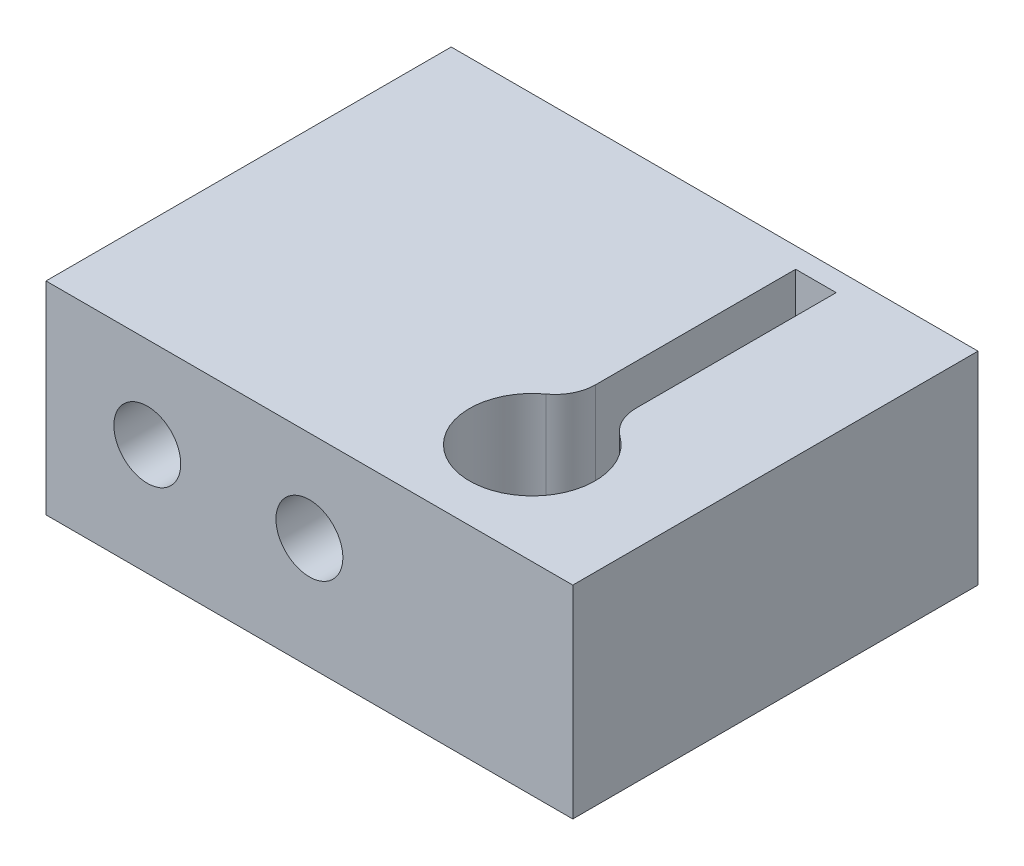
ISO-10303-21;
HEADER;
FILE_DESCRIPTION(('STEP AP214'),'2;1');
FILE_NAME('part.step','',(''),(''),'','','');
FILE_SCHEMA(('AUTOMOTIVE_DESIGN { 1 0 10303 214 1 1 1 1 }'));
ENDSEC;
DATA;
#1=APPLICATION_CONTEXT('core data for automotive mechanical design processes');
#2=APPLICATION_PROTOCOL_DEFINITION('international standard','automotive_design',2000,#1);
#3=PRODUCT_CONTEXT('',#1,'mechanical');
#4=PRODUCT('Part','Part','',(#3));
#5=PRODUCT_RELATED_PRODUCT_CATEGORY('part','',(#4));
#6=PRODUCT_DEFINITION_FORMATION('','',#4);
#7=PRODUCT_DEFINITION_CONTEXT('part definition',#1,'design');
#8=PRODUCT_DEFINITION('design','',#6,#7);
#9=PRODUCT_DEFINITION_SHAPE('','',#8);
#10=(LENGTH_UNIT() NAMED_UNIT(*) SI_UNIT(.MILLI.,.METRE.));
#11=(NAMED_UNIT(*) PLANE_ANGLE_UNIT() SI_UNIT($,.RADIAN.));
#12=(NAMED_UNIT(*) SI_UNIT($,.STERADIAN.) SOLID_ANGLE_UNIT());
#13=UNCERTAINTY_MEASURE_WITH_UNIT(LENGTH_MEASURE(1.E-05),#10,'distance_accuracy_value','');
#14=(GEOMETRIC_REPRESENTATION_CONTEXT(3) GLOBAL_UNCERTAINTY_ASSIGNED_CONTEXT((#13)) GLOBAL_UNIT_ASSIGNED_CONTEXT((#10,
#11,#12)) REPRESENTATION_CONTEXT('',''));
#15=CARTESIAN_POINT('',(0.,0.,0.));
#16=DIRECTION('',(0.,0.,1.));
#17=DIRECTION('',(1.,0.,0.));
#18=AXIS2_PLACEMENT_3D('',#15,#16,#17);
#19=CARTESIAN_POINT('',(13.,25.,10.));
#20=DIRECTION('',(-1.,0.,0.));
#21=DIRECTION('',(0.,0.,1.));
#22=AXIS2_PLACEMENT_3D('',#19,#20,#21);
#23=PLANE('',#22);
#24=DIRECTION('',(0.,-1.,0.));
#25=VECTOR('',#24,1.);
#26=CARTESIAN_POINT('',(13.,25.,-10.));
#27=LINE('',#26,#25);
#28=CARTESIAN_POINT('',(13.,15.,-10.));
#29=VERTEX_POINT('',#28);
#30=CARTESIAN_POINT('',(13.,5.,-10.));
#31=VERTEX_POINT('',#30);
#32=EDGE_CURVE('E224',#29,#31,#27,.T.);
#33=ORIENTED_EDGE('',*,*,#32,.F.);
#34=DIRECTION('',(0.,0.,-1.));
#35=VECTOR('',#34,1.);
#36=CARTESIAN_POINT('',(13.,15.,10.));
#37=LINE('',#36,#35);
#38=CARTESIAN_POINT('',(13.,15.,10.));
#39=VERTEX_POINT('',#38);
#40=EDGE_CURVE('E152',#39,#29,#37,.T.);
#41=ORIENTED_EDGE('',*,*,#40,.F.);
#42=DIRECTION('',(0.,-1.,0.));
#43=VECTOR('',#42,1.);
#44=CARTESIAN_POINT('',(13.,25.,10.));
#45=LINE('',#44,#43);
#46=CARTESIAN_POINT('',(13.,5.,10.));
#47=VERTEX_POINT('',#46);
#48=EDGE_CURVE('E203',#39,#47,#45,.T.);
#49=ORIENTED_EDGE('',*,*,#48,.T.);
#50=DIRECTION('',(0.,0.,1.));
#51=VECTOR('',#50,1.);
#52=CARTESIAN_POINT('',(13.,5.,10.));
#53=LINE('',#52,#51);
#54=EDGE_CURVE('E169',#31,#47,#53,.T.);
#55=ORIENTED_EDGE('',*,*,#54,.F.);
#56=EDGE_LOOP('',(#33,#41,#49,#55));
#57=FACE_BOUND('',#56,.T.);
#58=ADVANCED_FACE('F42',(#57),#23,.F.);
#59=CARTESIAN_POINT('',(-13.,25.,-10.));
#60=DIRECTION('',(0.,0.,1.));
#61=DIRECTION('',(1.,0.,0.));
#62=AXIS2_PLACEMENT_3D('',#59,#60,#61);
#63=PLANE('',#62);
#64=DIRECTION('',(1.,0.,0.));
#65=VECTOR('',#64,1.);
#66=CARTESIAN_POINT('',(-13.,5.,-10.));
#67=LINE('',#66,#65);
#68=CARTESIAN_POINT('',(-13.,5.,-10.));
#69=VERTEX_POINT('',#68);
#70=EDGE_CURVE('E174',#69,#31,#67,.T.);
#71=ORIENTED_EDGE('',*,*,#70,.F.);
#72=DIRECTION('',(0.,-1.,0.));
#73=VECTOR('',#72,1.);
#74=CARTESIAN_POINT('',(-13.,25.,-10.));
#75=LINE('',#74,#73);
#76=CARTESIAN_POINT('',(-13.,15.,-10.));
#77=VERTEX_POINT('',#76);
#78=EDGE_CURVE('E220',#77,#69,#75,.T.);
#79=ORIENTED_EDGE('',*,*,#78,.F.);
#80=DIRECTION('',(-1.,0.,0.));
#81=VECTOR('',#80,1.);
#82=CARTESIAN_POINT('',(13.,15.,-10.));
#83=LINE('',#82,#81);
#84=EDGE_CURVE('E146',#29,#77,#83,.T.);
#85=ORIENTED_EDGE('',*,*,#84,.F.);
#86=ORIENTED_EDGE('',*,*,#32,.T.);
#87=EDGE_LOOP('',(#71,#79,#85,#86));
#88=FACE_BOUND('',#87,.T.);
#89=CARTESIAN_POINT('',(0.,10.5,-10.));
#90=DIRECTION('',(0.,0.,-1.));
#91=DIRECTION('',(-1.,0.,0.));
#92=AXIS2_PLACEMENT_3D('',#89,#90,#91);
#93=CIRCLE('',#92,1.65);
#94=CARTESIAN_POINT('',(-1.65,10.5,-10.));
#95=VERTEX_POINT('',#94);
#96=EDGE_CURVE('E208',#95,#95,#93,.T.);
#97=ORIENTED_EDGE('',*,*,#96,.F.);
#98=EDGE_LOOP('',(#97));
#99=FACE_BOUND('',#98,.T.);
#100=CARTESIAN_POINT('',(-8.,10.5,-10.));
#101=DIRECTION('',(0.,0.,-1.));
#102=DIRECTION('',(-1.,0.,0.));
#103=AXIS2_PLACEMENT_3D('',#100,#101,#102);
#104=CIRCLE('',#103,1.65);
#105=CARTESIAN_POINT('',(-9.65,10.5,-10.));
#106=VERTEX_POINT('',#105);
#107=EDGE_CURVE('E204',#106,#106,#104,.T.);
#108=ORIENTED_EDGE('',*,*,#107,.F.);
#109=EDGE_LOOP('',(#108));
#110=FACE_BOUND('',#109,.T.);
#111=ADVANCED_FACE('F265',(#88,#99,#110),#63,.F.);
#112=CARTESIAN_POINT('',(-13.,25.,10.));
#113=DIRECTION('',(1.,0.,0.));
#114=DIRECTION('',(0.,0.,-1.));
#115=AXIS2_PLACEMENT_3D('',#112,#113,#114);
#116=PLANE('',#115);
#117=DIRECTION('',(0.,-1.,0.));
#118=VECTOR('',#117,1.);
#119=CARTESIAN_POINT('',(-13.,25.,10.));
#120=LINE('',#119,#118);
#121=CARTESIAN_POINT('',(-13.,15.,10.));
#122=VERTEX_POINT('',#121);
#123=CARTESIAN_POINT('',(-13.,5.,10.));
#124=VERTEX_POINT('',#123);
#125=EDGE_CURVE('E217',#122,#124,#120,.T.);
#126=ORIENTED_EDGE('',*,*,#125,.F.);
#127=DIRECTION('',(0.,0.,-1.));
#128=VECTOR('',#127,1.);
#129=CARTESIAN_POINT('',(-13.,15.,10.));
#130=LINE('',#129,#128);
#131=EDGE_CURVE('E129',#122,#77,#130,.T.);
#132=ORIENTED_EDGE('',*,*,#131,.T.);
#133=ORIENTED_EDGE('',*,*,#78,.T.);
#134=DIRECTION('',(0.,0.,1.));
#135=VECTOR('',#134,1.);
#136=CARTESIAN_POINT('',(-13.,5.,10.));
#137=LINE('',#136,#135);
#138=EDGE_CURVE('E170',#69,#124,#137,.T.);
#139=ORIENTED_EDGE('',*,*,#138,.T.);
#140=EDGE_LOOP('',(#126,#132,#133,#139));
#141=FACE_BOUND('',#140,.T.);
#142=ADVANCED_FACE('F273',(#141),#116,.F.);
#143=CARTESIAN_POINT('',(-13.,25.,10.));
#144=DIRECTION('',(0.,0.,-1.));
#145=DIRECTION('',(-1.,0.,0.));
#146=AXIS2_PLACEMENT_3D('',#143,#144,#145);
#147=PLANE('',#146);
#148=CARTESIAN_POINT('',(-8.,10.5,10.));
#149=DIRECTION('',(0.,0.,-1.));
#150=DIRECTION('',(-1.,0.,0.));
#151=AXIS2_PLACEMENT_3D('',#148,#149,#150);
#152=CIRCLE('',#151,1.65);
#153=CARTESIAN_POINT('',(-9.65,10.5,10.));
#154=VERTEX_POINT('',#153);
#155=EDGE_CURVE('E199',#154,#154,#152,.T.);
#156=ORIENTED_EDGE('',*,*,#155,.T.);
#157=EDGE_LOOP('',(#156));
#158=FACE_BOUND('',#157,.T.);
#159=CARTESIAN_POINT('',(0.,10.5,10.));
#160=DIRECTION('',(0.,0.,-1.));
#161=DIRECTION('',(-1.,0.,0.));
#162=AXIS2_PLACEMENT_3D('',#159,#160,#161);
#163=CIRCLE('',#162,1.65);
#164=CARTESIAN_POINT('',(-1.65,10.5,10.));
#165=VERTEX_POINT('',#164);
#166=EDGE_CURVE('E198',#165,#165,#163,.T.);
#167=ORIENTED_EDGE('',*,*,#166,.T.);
#168=EDGE_LOOP('',(#167));
#169=FACE_BOUND('',#168,.T.);
#170=ORIENTED_EDGE('',*,*,#48,.F.);
#171=DIRECTION('',(-1.,0.,0.));
#172=VECTOR('',#171,1.);
#173=CARTESIAN_POINT('',(13.,15.,10.));
#174=LINE('',#173,#172);
#175=EDGE_CURVE('E148',#39,#122,#174,.T.);
#176=ORIENTED_EDGE('',*,*,#175,.T.);
#177=ORIENTED_EDGE('',*,*,#125,.T.);
#178=DIRECTION('',(1.,0.,0.));
#179=VECTOR('',#178,1.);
#180=CARTESIAN_POINT('',(-13.,5.,10.));
#181=LINE('',#180,#179);
#182=EDGE_CURVE('E178',#124,#47,#181,.T.);
#183=ORIENTED_EDGE('',*,*,#182,.T.);
#184=EDGE_LOOP('',(#170,#176,#177,#183));
#185=FACE_BOUND('',#184,.T.);
#186=ADVANCED_FACE('F279',(#158,#169,#185),#147,.F.);
#187=CARTESIAN_POINT('',(6.,16.,5.));
#188=DIRECTION('',(0.,-1.,0.));
#189=DIRECTION('',(0.,0.,-1.));
#190=AXIS2_PLACEMENT_3D('',#187,#188,#189);
#191=CYLINDRICAL_SURFACE('',#190,3.1);
#192=DIRECTION('',(0.,-1.,0.));
#193=VECTOR('',#192,1.);
#194=CARTESIAN_POINT('',(4.17647058823529,16.,2.49306153158298));
#195=LINE('',#194,#193);
#196=CARTESIAN_POINT('',(4.17647058823529,5.,2.49306153158298));
#197=VERTEX_POINT('',#196);
#198=CARTESIAN_POINT('',(4.17647058823529,15.,2.49306153158298));
#199=VERTEX_POINT('',#198);
#200=EDGE_CURVE('E227',#197,#199,#195,.F.);
#201=ORIENTED_EDGE('',*,*,#200,.T.);
#202=CARTESIAN_POINT('',(6.,15.,5.));
#203=DIRECTION('',(0.,-1.,0.));
#204=DIRECTION('',(1.,0.,0.));
#205=AXIS2_PLACEMENT_3D('',#202,#203,#204);
#206=CIRCLE('',#205,3.1);
#207=CARTESIAN_POINT('',(7.8235294117647,15.,2.49306153158298));
#208=VERTEX_POINT('',#207);
#209=EDGE_CURVE('E128',#199,#208,#206,.F.);
#210=ORIENTED_EDGE('',*,*,#209,.T.);
#211=DIRECTION('',(0.,-1.,0.));
#212=VECTOR('',#211,1.);
#213=CARTESIAN_POINT('',(7.8235294117647,16.,2.49306153158298));
#214=LINE('',#213,#212);
#215=CARTESIAN_POINT('',(7.8235294117647,5.,2.49306153158298));
#216=VERTEX_POINT('',#215);
#217=EDGE_CURVE('E231',#208,#216,#214,.T.);
#218=ORIENTED_EDGE('',*,*,#217,.T.);
#219=CARTESIAN_POINT('',(6.,5.,5.));
#220=DIRECTION('',(0.,1.,0.));
#221=DIRECTION('',(0.,0.,1.));
#222=AXIS2_PLACEMENT_3D('',#219,#220,#221);
#223=CIRCLE('',#222,3.1);
#224=EDGE_CURVE('E187',#216,#197,#223,.F.);
#225=ORIENTED_EDGE('',*,*,#224,.T.);
#226=EDGE_LOOP('',(#201,#210,#218,#225));
#227=FACE_BOUND('',#226,.T.);
#228=ADVANCED_FACE('F250',(#227),#191,.F.);
#229=CARTESIAN_POINT('',(7.,16.,2.06571984977576));
#230=DIRECTION('',(1.,0.,0.));
#231=DIRECTION('',(0.,0.,-1.));
#232=AXIS2_PLACEMENT_3D('',#229,#230,#231);
#233=PLANE('',#232);
#234=DIRECTION('',(0.,0.,-1.));
#235=VECTOR('',#234,1.);
#236=CARTESIAN_POINT('',(7.,15.,2.06571984977576));
#237=LINE('',#236,#235);
#238=CARTESIAN_POINT('',(7.,15.,0.875681874539743));
#239=VERTEX_POINT('',#238);
#240=CARTESIAN_POINT('',(7.,15.,-9.00000000000001));
#241=VERTEX_POINT('',#240);
#242=EDGE_CURVE('E166',#239,#241,#237,.T.);
#243=ORIENTED_EDGE('',*,*,#242,.T.);
#244=DIRECTION('',(0.,1.,0.));
#245=VECTOR('',#244,1.);
#246=CARTESIAN_POINT('',(7.,5.,-9.));
#247=LINE('',#246,#245);
#248=CARTESIAN_POINT('',(7.,5.,-9.00000000000001));
#249=VERTEX_POINT('',#248);
#250=EDGE_CURVE('E58',#249,#241,#247,.T.);
#251=ORIENTED_EDGE('',*,*,#250,.F.);
#252=DIRECTION('',(0.,0.,1.));
#253=VECTOR('',#252,1.);
#254=CARTESIAN_POINT('',(7.,5.,2.06571984977576));
#255=LINE('',#254,#253);
#256=CARTESIAN_POINT('',(7.,5.,0.875681874539743));
#257=VERTEX_POINT('',#256);
#258=EDGE_CURVE('E195',#249,#257,#255,.T.);
#259=ORIENTED_EDGE('',*,*,#258,.T.);
#260=DIRECTION('',(0.,-1.,0.));
#261=VECTOR('',#260,1.);
#262=CARTESIAN_POINT('',(7.,16.,0.875681874539743));
#263=LINE('',#262,#261);
#264=EDGE_CURVE('E234',#257,#239,#263,.F.);
#265=ORIENTED_EDGE('',*,*,#264,.T.);
#266=EDGE_LOOP('',(#243,#251,#259,#265));
#267=FACE_BOUND('',#266,.T.);
#268=ADVANCED_FACE('F286',(#267),#233,.F.);
#269=CARTESIAN_POINT('',(5.,16.,2.06571984977576));
#270=DIRECTION('',(-1.,0.,0.));
#271=DIRECTION('',(0.,0.,1.));
#272=AXIS2_PLACEMENT_3D('',#269,#270,#271);
#273=PLANE('',#272);
#274=DIRECTION('',(0.,0.,-1.));
#275=VECTOR('',#274,1.);
#276=CARTESIAN_POINT('',(5.,5.,2.06571984977576));
#277=LINE('',#276,#275);
#278=CARTESIAN_POINT('',(5.,5.,0.875681874539745));
#279=VERTEX_POINT('',#278);
#280=CARTESIAN_POINT('',(5.,5.,-9.00000000000001));
#281=VERTEX_POINT('',#280);
#282=EDGE_CURVE('E66',#279,#281,#277,.T.);
#283=ORIENTED_EDGE('',*,*,#282,.T.);
#284=DIRECTION('',(0.,1.,0.));
#285=VECTOR('',#284,1.);
#286=CARTESIAN_POINT('',(5.,5.,-9.));
#287=LINE('',#286,#285);
#288=CARTESIAN_POINT('',(5.,15.,-9.));
#289=VERTEX_POINT('',#288);
#290=EDGE_CURVE('E131',#281,#289,#287,.T.);
#291=ORIENTED_EDGE('',*,*,#290,.T.);
#292=DIRECTION('',(0.,0.,1.));
#293=VECTOR('',#292,1.);
#294=CARTESIAN_POINT('',(5.,15.,2.06571984977576));
#295=LINE('',#294,#293);
#296=CARTESIAN_POINT('',(5.,15.,0.875681874539744));
#297=VERTEX_POINT('',#296);
#298=EDGE_CURVE('E120',#289,#297,#295,.T.);
#299=ORIENTED_EDGE('',*,*,#298,.T.);
#300=DIRECTION('',(0.,-1.,0.));
#301=VECTOR('',#300,1.);
#302=CARTESIAN_POINT('',(5.,16.,0.875681874539745));
#303=LINE('',#302,#301);
#304=EDGE_CURVE('E238',#297,#279,#303,.T.);
#305=ORIENTED_EDGE('',*,*,#304,.T.);
#306=EDGE_LOOP('',(#283,#291,#299,#305));
#307=FACE_BOUND('',#306,.T.);
#308=ADVANCED_FACE('F132',(#307),#273,.F.);
#309=CARTESIAN_POINT('',(9.,16.,0.875681874539743));
#310=DIRECTION('',(0.,-1.,0.));
#311=DIRECTION('',(0.,0.,-1.));
#312=AXIS2_PLACEMENT_3D('',#309,#310,#311);
#313=CYLINDRICAL_SURFACE('',#312,2.);
#314=CARTESIAN_POINT('',(9.,15.,0.875681874539743));
#315=DIRECTION('',(0.,-1.,0.));
#316=DIRECTION('',(1.,0.,0.));
#317=AXIS2_PLACEMENT_3D('',#314,#315,#316);
#318=CIRCLE('',#317,2.);
#319=EDGE_CURVE('E163',#239,#208,#318,.F.);
#320=ORIENTED_EDGE('',*,*,#319,.F.);
#321=ORIENTED_EDGE('',*,*,#264,.F.);
#322=CARTESIAN_POINT('',(9.,5.,0.875681874539743));
#323=DIRECTION('',(0.,1.,0.));
#324=DIRECTION('',(0.,0.,1.));
#325=AXIS2_PLACEMENT_3D('',#322,#323,#324);
#326=CIRCLE('',#325,2.);
#327=EDGE_CURVE('E191',#216,#257,#326,.F.);
#328=ORIENTED_EDGE('',*,*,#327,.F.);
#329=ORIENTED_EDGE('',*,*,#217,.F.);
#330=EDGE_LOOP('',(#320,#321,#328,#329));
#331=FACE_BOUND('',#330,.T.);
#332=ADVANCED_FACE('F254',(#331),#313,.T.);
#333=CARTESIAN_POINT('',(3.,16.,0.875681874539744));
#334=DIRECTION('',(0.,-1.,0.));
#335=DIRECTION('',(0.,0.,-1.));
#336=AXIS2_PLACEMENT_3D('',#333,#334,#335);
#337=CYLINDRICAL_SURFACE('',#336,2.);
#338=CARTESIAN_POINT('',(3.,15.,0.875681874539744));
#339=DIRECTION('',(0.,-1.,0.));
#340=DIRECTION('',(1.,0.,0.));
#341=AXIS2_PLACEMENT_3D('',#338,#339,#340);
#342=CIRCLE('',#341,2.);
#343=EDGE_CURVE('E11',#199,#297,#342,.F.);
#344=ORIENTED_EDGE('',*,*,#343,.F.);
#345=ORIENTED_EDGE('',*,*,#200,.F.);
#346=CARTESIAN_POINT('',(3.,5.,0.875681874539744));
#347=DIRECTION('',(0.,1.,0.));
#348=DIRECTION('',(0.,0.,1.));
#349=AXIS2_PLACEMENT_3D('',#346,#347,#348);
#350=CIRCLE('',#349,2.);
#351=EDGE_CURVE('E51',#279,#197,#350,.F.);
#352=ORIENTED_EDGE('',*,*,#351,.F.);
#353=ORIENTED_EDGE('',*,*,#304,.F.);
#354=EDGE_LOOP('',(#344,#345,#352,#353));
#355=FACE_BOUND('',#354,.T.);
#356=ADVANCED_FACE('F44',(#355),#337,.T.);
#357=CARTESIAN_POINT('',(0.,10.5,10.));
#358=DIRECTION('',(0.,0.,-1.));
#359=DIRECTION('',(-1.,0.,0.));
#360=AXIS2_PLACEMENT_3D('',#357,#358,#359);
#361=CYLINDRICAL_SURFACE('',#360,1.65);
#362=ORIENTED_EDGE('',*,*,#166,.F.);
#363=EDGE_LOOP('',(#362));
#364=FACE_BOUND('',#363,.T.);
#365=ORIENTED_EDGE('',*,*,#96,.T.);
#366=EDGE_LOOP('',(#365));
#367=FACE_BOUND('',#366,.T.);
#368=ADVANCED_FACE('F253',(#364,#367),#361,.F.);
#369=CARTESIAN_POINT('',(-8.,10.5,10.));
#370=DIRECTION('',(0.,0.,-1.));
#371=DIRECTION('',(-1.,0.,0.));
#372=AXIS2_PLACEMENT_3D('',#369,#370,#371);
#373=CYLINDRICAL_SURFACE('',#372,1.65);
#374=ORIENTED_EDGE('',*,*,#155,.F.);
#375=EDGE_LOOP('',(#374));
#376=FACE_BOUND('',#375,.T.);
#377=ORIENTED_EDGE('',*,*,#107,.T.);
#378=EDGE_LOOP('',(#377));
#379=FACE_BOUND('',#378,.T.);
#380=ADVANCED_FACE('F260',(#376,#379),#373,.F.);
#381=CARTESIAN_POINT('',(-13.,5.,10.));
#382=DIRECTION('',(0.,1.,0.));
#383=DIRECTION('',(0.,0.,1.));
#384=AXIS2_PLACEMENT_3D('',#381,#382,#383);
#385=PLANE('',#384);
#386=DIRECTION('',(1.,0.,0.));
#387=VECTOR('',#386,1.);
#388=CARTESIAN_POINT('',(5.,5.,-9.));
#389=LINE('',#388,#387);
#390=EDGE_CURVE('E137',#281,#249,#389,.T.);
#391=ORIENTED_EDGE('',*,*,#390,.F.);
#392=ORIENTED_EDGE('',*,*,#282,.F.);
#393=ORIENTED_EDGE('',*,*,#351,.T.);
#394=ORIENTED_EDGE('',*,*,#224,.F.);
#395=ORIENTED_EDGE('',*,*,#327,.T.);
#396=ORIENTED_EDGE('',*,*,#258,.F.);
#397=EDGE_LOOP('',(#391,#392,#393,#394,#395,#396));
#398=FACE_BOUND('',#397,.T.);
#399=ORIENTED_EDGE('',*,*,#70,.T.);
#400=ORIENTED_EDGE('',*,*,#54,.T.);
#401=ORIENTED_EDGE('',*,*,#182,.F.);
#402=ORIENTED_EDGE('',*,*,#138,.F.);
#403=EDGE_LOOP('',(#399,#400,#401,#402));
#404=FACE_BOUND('',#403,.T.);
#405=ADVANCED_FACE('F244',(#398,#404),#385,.F.);
#406=CARTESIAN_POINT('',(13.,15.,10.));
#407=DIRECTION('',(0.,-1.,0.));
#408=DIRECTION('',(1.,0.,0.));
#409=AXIS2_PLACEMENT_3D('',#406,#407,#408);
#410=PLANE('',#409);
#411=ORIENTED_EDGE('',*,*,#298,.F.);
#412=DIRECTION('',(1.,0.,0.));
#413=VECTOR('',#412,1.);
#414=CARTESIAN_POINT('',(5.,15.,-9.));
#415=LINE('',#414,#413);
#416=EDGE_CURVE('E124',#289,#241,#415,.T.);
#417=ORIENTED_EDGE('',*,*,#416,.T.);
#418=ORIENTED_EDGE('',*,*,#242,.F.);
#419=ORIENTED_EDGE('',*,*,#319,.T.);
#420=ORIENTED_EDGE('',*,*,#209,.F.);
#421=ORIENTED_EDGE('',*,*,#343,.T.);
#422=EDGE_LOOP('',(#411,#417,#418,#419,#420,#421));
#423=FACE_BOUND('',#422,.T.);
#424=ORIENTED_EDGE('',*,*,#84,.T.);
#425=ORIENTED_EDGE('',*,*,#131,.F.);
#426=ORIENTED_EDGE('',*,*,#175,.F.);
#427=ORIENTED_EDGE('',*,*,#40,.T.);
#428=EDGE_LOOP('',(#424,#425,#426,#427));
#429=FACE_BOUND('',#428,.T.);
#430=ADVANCED_FACE('F121',(#423,#429),#410,.F.);
#431=CARTESIAN_POINT('',(5.,5.,-9.));
#432=DIRECTION('',(0.,0.,1.));
#433=DIRECTION('',(1.,0.,0.));
#434=AXIS2_PLACEMENT_3D('',#431,#432,#433);
#435=PLANE('',#434);
#436=ORIENTED_EDGE('',*,*,#416,.F.);
#437=ORIENTED_EDGE('',*,*,#290,.F.);
#438=ORIENTED_EDGE('',*,*,#390,.T.);
#439=ORIENTED_EDGE('',*,*,#250,.T.);
#440=EDGE_LOOP('',(#436,#437,#438,#439));
#441=FACE_BOUND('',#440,.T.);
#442=ADVANCED_FACE('F139',(#441),#435,.T.);
#443=CLOSED_SHELL('',(#58,#111,#142,#186,#228,#268,#308,#332,#356,#368,#380,#405,#430,#442));
#444=MANIFOLD_SOLID_BREP('B2',#443);
#445=ADVANCED_BREP_SHAPE_REPRESENTATION('',(#18,#444),#14);
#446=SHAPE_DEFINITION_REPRESENTATION(#9,#445);
ENDSEC;
END-ISO-10303-21;
